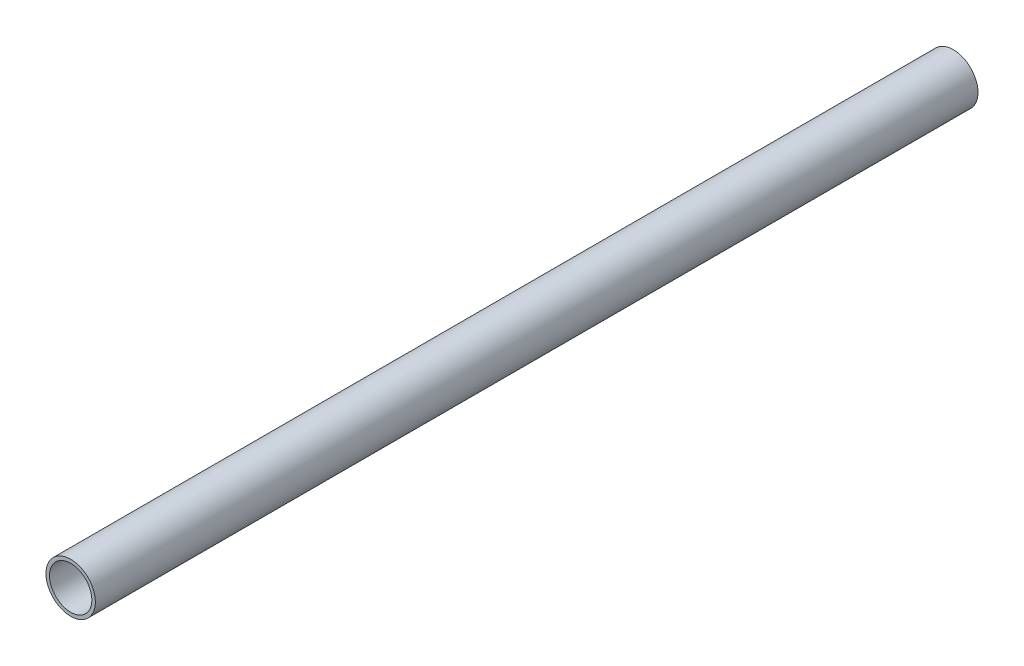
ISO-10303-21;
HEADER;
FILE_DESCRIPTION(('STEP AP214'),'2;1');
FILE_NAME('part.step','',(''),(''),'','','');
FILE_SCHEMA(('AUTOMOTIVE_DESIGN { 1 0 10303 214 1 1 1 1 }'));
ENDSEC;
DATA;
#1=APPLICATION_CONTEXT('core data for automotive mechanical design processes');
#2=APPLICATION_PROTOCOL_DEFINITION('international standard','automotive_design',2000,#1);
#3=PRODUCT_CONTEXT('',#1,'mechanical');
#4=PRODUCT('Part','Part','',(#3));
#5=PRODUCT_RELATED_PRODUCT_CATEGORY('part','',(#4));
#6=PRODUCT_DEFINITION_FORMATION('','',#4);
#7=PRODUCT_DEFINITION_CONTEXT('part definition',#1,'design');
#8=PRODUCT_DEFINITION('design','',#6,#7);
#9=PRODUCT_DEFINITION_SHAPE('','',#8);
#10=(LENGTH_UNIT() NAMED_UNIT(*) SI_UNIT(.MILLI.,.METRE.));
#11=(NAMED_UNIT(*) PLANE_ANGLE_UNIT() SI_UNIT($,.RADIAN.));
#12=(NAMED_UNIT(*) SI_UNIT($,.STERADIAN.) SOLID_ANGLE_UNIT());
#13=UNCERTAINTY_MEASURE_WITH_UNIT(LENGTH_MEASURE(1.E-05),#10,'distance_accuracy_value','');
#14=(GEOMETRIC_REPRESENTATION_CONTEXT(3) GLOBAL_UNCERTAINTY_ASSIGNED_CONTEXT((#13)) GLOBAL_UNIT_ASSIGNED_CONTEXT((#10,
#11,#12)) REPRESENTATION_CONTEXT('',''));
#15=CARTESIAN_POINT('',(0.,0.,0.));
#16=DIRECTION('',(0.,0.,1.));
#17=DIRECTION('',(1.,0.,0.));
#18=AXIS2_PLACEMENT_3D('',#15,#16,#17);
#19=CARTESIAN_POINT('',(-2.3712195784734,4.28873029126909,250.));
#20=DIRECTION('',(0.,0.,1.));
#21=DIRECTION('',(1.,0.,0.));
#22=AXIS2_PLACEMENT_3D('',#19,#20,#21);
#23=PLANE('',#22);
#24=CARTESIAN_POINT('',(-2.3712195784734,4.28873029126909,250.));
#25=DIRECTION('',(0.,0.,1.));
#26=DIRECTION('',(1.,0.,0.));
#27=AXIS2_PLACEMENT_3D('',#24,#25,#26);
#28=CIRCLE('',#27,7.);
#29=CARTESIAN_POINT('',(4.6287804215266,4.28873029126909,250.));
#30=VERTEX_POINT('',#29);
#31=EDGE_CURVE('E10',#30,#30,#28,.T.);
#32=ORIENTED_EDGE('',*,*,#31,.T.);
#33=EDGE_LOOP('',(#32));
#34=FACE_BOUND('',#33,.T.);
#35=CARTESIAN_POINT('',(-2.3712195784734,4.28873029126909,250.));
#36=DIRECTION('',(0.,0.,1.));
#37=DIRECTION('',(1.,0.,0.));
#38=AXIS2_PLACEMENT_3D('',#35,#36,#37);
#39=CIRCLE('',#38,6.);
#40=CARTESIAN_POINT('',(3.6287804215266,4.28873029126909,250.));
#41=VERTEX_POINT('',#40);
#42=EDGE_CURVE('E46',#41,#41,#39,.T.);
#43=ORIENTED_EDGE('',*,*,#42,.F.);
#44=EDGE_LOOP('',(#43));
#45=FACE_BOUND('',#44,.T.);
#46=ADVANCED_FACE('F35',(#34,#45),#23,.T.);
#47=CARTESIAN_POINT('',(-2.3712195784734,4.28873029126909,0.));
#48=DIRECTION('',(0.,0.,1.));
#49=DIRECTION('',(1.,0.,0.));
#50=AXIS2_PLACEMENT_3D('',#47,#48,#49);
#51=PLANE('',#50);
#52=CARTESIAN_POINT('',(-2.3712195784734,4.28873029126909,0.));
#53=DIRECTION('',(0.,0.,1.));
#54=DIRECTION('',(1.,0.,0.));
#55=AXIS2_PLACEMENT_3D('',#52,#53,#54);
#56=CIRCLE('',#55,7.);
#57=CARTESIAN_POINT('',(4.6287804215266,4.28873029126909,0.));
#58=VERTEX_POINT('',#57);
#59=EDGE_CURVE('E39',#58,#58,#56,.T.);
#60=ORIENTED_EDGE('',*,*,#59,.F.);
#61=EDGE_LOOP('',(#60));
#62=FACE_BOUND('',#61,.T.);
#63=CARTESIAN_POINT('',(-2.3712195784734,4.28873029126909,0.));
#64=DIRECTION('',(0.,0.,1.));
#65=DIRECTION('',(1.,0.,0.));
#66=AXIS2_PLACEMENT_3D('',#63,#64,#65);
#67=CIRCLE('',#66,6.);
#68=CARTESIAN_POINT('',(3.6287804215266,4.28873029126909,0.));
#69=VERTEX_POINT('',#68);
#70=EDGE_CURVE('E48',#69,#69,#67,.T.);
#71=ORIENTED_EDGE('',*,*,#70,.T.);
#72=EDGE_LOOP('',(#71));
#73=FACE_BOUND('',#72,.T.);
#74=ADVANCED_FACE('F58',(#62,#73),#51,.F.);
#75=CARTESIAN_POINT('',(-2.3712195784734,4.28873029126909,250.));
#76=DIRECTION('',(0.,0.,-1.));
#77=DIRECTION('',(-1.,0.,0.));
#78=AXIS2_PLACEMENT_3D('',#75,#76,#77);
#79=CYLINDRICAL_SURFACE('',#78,7.);
#80=ORIENTED_EDGE('',*,*,#31,.F.);
#81=EDGE_LOOP('',(#80));
#82=FACE_BOUND('',#81,.T.);
#83=ORIENTED_EDGE('',*,*,#59,.T.);
#84=EDGE_LOOP('',(#83));
#85=FACE_BOUND('',#84,.T.);
#86=ADVANCED_FACE('F37',(#82,#85),#79,.T.);
#87=CARTESIAN_POINT('',(-2.3712195784734,4.28873029126909,250.));
#88=DIRECTION('',(0.,0.,-1.));
#89=DIRECTION('',(-1.,0.,0.));
#90=AXIS2_PLACEMENT_3D('',#87,#88,#89);
#91=CYLINDRICAL_SURFACE('',#90,6.);
#92=ORIENTED_EDGE('',*,*,#42,.T.);
#93=EDGE_LOOP('',(#92));
#94=FACE_BOUND('',#93,.T.);
#95=ORIENTED_EDGE('',*,*,#70,.F.);
#96=EDGE_LOOP('',(#95));
#97=FACE_BOUND('',#96,.T.);
#98=ADVANCED_FACE('F54',(#94,#97),#91,.F.);
#99=CLOSED_SHELL('',(#46,#74,#86,#98));
#100=MANIFOLD_SOLID_BREP('B2',#99);
#101=ADVANCED_BREP_SHAPE_REPRESENTATION('',(#18,#100),#14);
#102=SHAPE_DEFINITION_REPRESENTATION(#9,#101);
ENDSEC;
END-ISO-10303-21;
